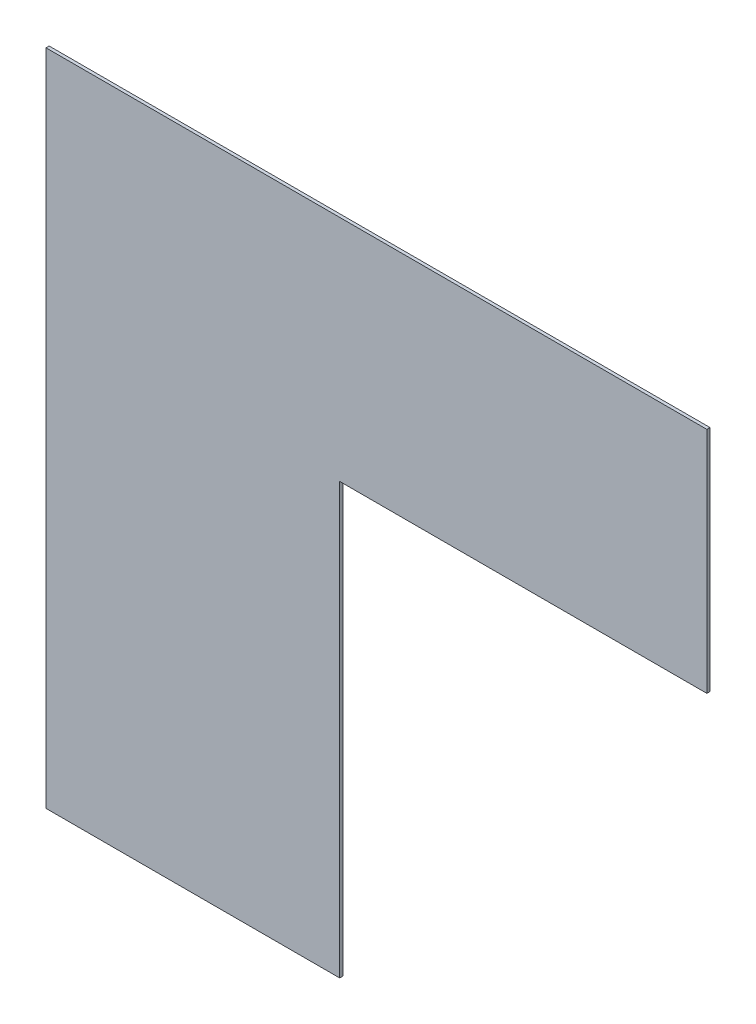
ISO-10303-21;
HEADER;
FILE_DESCRIPTION(('STEP AP214'),'2;1');
FILE_NAME('part.step','',(''),(''),'','','');
FILE_SCHEMA(('AUTOMOTIVE_DESIGN { 1 0 10303 214 1 1 1 1 }'));
ENDSEC;
DATA;
#1=APPLICATION_CONTEXT('core data for automotive mechanical design processes');
#2=APPLICATION_PROTOCOL_DEFINITION('international standard','automotive_design',2000,#1);
#3=PRODUCT_CONTEXT('',#1,'mechanical');
#4=PRODUCT('Part','Part','',(#3));
#5=PRODUCT_RELATED_PRODUCT_CATEGORY('part','',(#4));
#6=PRODUCT_DEFINITION_FORMATION('','',#4);
#7=PRODUCT_DEFINITION_CONTEXT('part definition',#1,'design');
#8=PRODUCT_DEFINITION('design','',#6,#7);
#9=PRODUCT_DEFINITION_SHAPE('','',#8);
#10=(LENGTH_UNIT() NAMED_UNIT(*) SI_UNIT(.MILLI.,.METRE.));
#11=(NAMED_UNIT(*) PLANE_ANGLE_UNIT() SI_UNIT($,.RADIAN.));
#12=(NAMED_UNIT(*) SI_UNIT($,.STERADIAN.) SOLID_ANGLE_UNIT());
#13=UNCERTAINTY_MEASURE_WITH_UNIT(LENGTH_MEASURE(1.E-05),#10,'distance_accuracy_value','');
#14=(GEOMETRIC_REPRESENTATION_CONTEXT(3) GLOBAL_UNCERTAINTY_ASSIGNED_CONTEXT((#13)) GLOBAL_UNIT_ASSIGNED_CONTEXT((#10,
#11,#12)) REPRESENTATION_CONTEXT('',''));
#15=CARTESIAN_POINT('',(0.,0.,0.));
#16=DIRECTION('',(0.,0.,1.));
#17=DIRECTION('',(1.,0.,0.));
#18=AXIS2_PLACEMENT_3D('',#15,#16,#17);
#19=CARTESIAN_POINT('',(350.,628.,3.));
#20=DIRECTION('',(-1.,0.,0.));
#21=DIRECTION('',(0.,0.,1.));
#22=AXIS2_PLACEMENT_3D('',#19,#20,#21);
#23=PLANE('',#22);
#24=DIRECTION('',(0.,1.,0.));
#25=VECTOR('',#24,1.);
#26=CARTESIAN_POINT('',(350.,628.,0.));
#27=LINE('',#26,#25);
#28=CARTESIAN_POINT('',(350.,410.,0.));
#29=VERTEX_POINT('',#28);
#30=CARTESIAN_POINT('',(350.,628.,0.));
#31=VERTEX_POINT('',#30);
#32=EDGE_CURVE('E116',#29,#31,#27,.T.);
#33=ORIENTED_EDGE('',*,*,#32,.T.);
#34=DIRECTION('',(0.,0.,-1.));
#35=VECTOR('',#34,1.);
#36=CARTESIAN_POINT('',(350.,628.,3.));
#37=LINE('',#36,#35);
#38=CARTESIAN_POINT('',(350.,628.,3.));
#39=VERTEX_POINT('',#38);
#40=EDGE_CURVE('E11',#39,#31,#37,.T.);
#41=ORIENTED_EDGE('',*,*,#40,.F.);
#42=DIRECTION('',(0.,1.,0.));
#43=VECTOR('',#42,1.);
#44=CARTESIAN_POINT('',(350.,628.,3.));
#45=LINE('',#44,#43);
#46=CARTESIAN_POINT('',(350.,410.,3.));
#47=VERTEX_POINT('',#46);
#48=EDGE_CURVE('E126',#47,#39,#45,.T.);
#49=ORIENTED_EDGE('',*,*,#48,.F.);
#50=DIRECTION('',(0.,0.,-1.));
#51=VECTOR('',#50,1.);
#52=CARTESIAN_POINT('',(350.,410.,3.));
#53=LINE('',#52,#51);
#54=EDGE_CURVE('E112',#47,#29,#53,.T.);
#55=ORIENTED_EDGE('',*,*,#54,.T.);
#56=EDGE_LOOP('',(#33,#41,#49,#55));
#57=FACE_BOUND('',#56,.T.);
#58=ADVANCED_FACE('F32',(#57),#23,.F.);
#59=CARTESIAN_POINT('',(350.,628.,3.));
#60=DIRECTION('',(0.,-1.,0.));
#61=DIRECTION('',(0.,0.,-1.));
#62=AXIS2_PLACEMENT_3D('',#59,#60,#61);
#63=PLANE('',#62);
#64=DIRECTION('',(-1.,0.,0.));
#65=VECTOR('',#64,1.);
#66=CARTESIAN_POINT('',(350.,628.,0.));
#67=LINE('',#66,#65);
#68=CARTESIAN_POINT('',(-280.,628.,0.));
#69=VERTEX_POINT('',#68);
#70=EDGE_CURVE('E119',#31,#69,#67,.T.);
#71=ORIENTED_EDGE('',*,*,#70,.T.);
#72=DIRECTION('',(0.,0.,-1.));
#73=VECTOR('',#72,1.);
#74=CARTESIAN_POINT('',(-280.,628.,3.));
#75=LINE('',#74,#73);
#76=CARTESIAN_POINT('',(-280.,628.,3.));
#77=VERTEX_POINT('',#76);
#78=EDGE_CURVE('E40',#77,#69,#75,.T.);
#79=ORIENTED_EDGE('',*,*,#78,.F.);
#80=DIRECTION('',(-1.,0.,0.));
#81=VECTOR('',#80,1.);
#82=CARTESIAN_POINT('',(350.,628.,3.));
#83=LINE('',#82,#81);
#84=EDGE_CURVE('E85',#39,#77,#83,.T.);
#85=ORIENTED_EDGE('',*,*,#84,.F.);
#86=ORIENTED_EDGE('',*,*,#40,.T.);
#87=EDGE_LOOP('',(#71,#79,#85,#86));
#88=FACE_BOUND('',#87,.T.);
#89=ADVANCED_FACE('F150',(#88),#63,.F.);
#90=CARTESIAN_POINT('',(-280.,628.,3.));
#91=DIRECTION('',(1.,0.,0.));
#92=DIRECTION('',(0.,0.,-1.));
#93=AXIS2_PLACEMENT_3D('',#90,#91,#92);
#94=PLANE('',#93);
#95=DIRECTION('',(0.,-1.,0.));
#96=VECTOR('',#95,1.);
#97=CARTESIAN_POINT('',(-280.,628.,0.));
#98=LINE('',#97,#96);
#99=CARTESIAN_POINT('',(-280.,0.,0.));
#100=VERTEX_POINT('',#99);
#101=EDGE_CURVE('E121',#69,#100,#98,.T.);
#102=ORIENTED_EDGE('',*,*,#101,.T.);
#103=DIRECTION('',(0.,0.,-1.));
#104=VECTOR('',#103,1.);
#105=CARTESIAN_POINT('',(-280.,0.,3.));
#106=LINE('',#105,#104);
#107=CARTESIAN_POINT('',(-280.,0.,3.));
#108=VERTEX_POINT('',#107);
#109=EDGE_CURVE('E107',#108,#100,#106,.T.);
#110=ORIENTED_EDGE('',*,*,#109,.F.);
#111=DIRECTION('',(0.,-1.,0.));
#112=VECTOR('',#111,1.);
#113=CARTESIAN_POINT('',(-280.,628.,3.));
#114=LINE('',#113,#112);
#115=EDGE_CURVE('E98',#77,#108,#114,.T.);
#116=ORIENTED_EDGE('',*,*,#115,.F.);
#117=ORIENTED_EDGE('',*,*,#78,.T.);
#118=EDGE_LOOP('',(#102,#110,#116,#117));
#119=FACE_BOUND('',#118,.T.);
#120=ADVANCED_FACE('F132',(#119),#94,.F.);
#121=CARTESIAN_POINT('',(0.,0.,3.));
#122=DIRECTION('',(0.,1.,0.));
#123=DIRECTION('',(-1.,0.,0.));
#124=AXIS2_PLACEMENT_3D('',#121,#122,#123);
#125=PLANE('',#124);
#126=DIRECTION('',(1.,0.,0.));
#127=VECTOR('',#126,1.);
#128=CARTESIAN_POINT('',(0.,0.,0.));
#129=LINE('',#128,#127);
#130=CARTESIAN_POINT('',(0.,0.,0.));
#131=VERTEX_POINT('',#130);
#132=EDGE_CURVE('E106',#100,#131,#129,.T.);
#133=ORIENTED_EDGE('',*,*,#132,.T.);
#134=DIRECTION('',(0.,0.,-1.));
#135=VECTOR('',#134,1.);
#136=CARTESIAN_POINT('',(0.,0.,3.));
#137=LINE('',#136,#135);
#138=CARTESIAN_POINT('',(0.,0.,3.));
#139=VERTEX_POINT('',#138);
#140=EDGE_CURVE('E103',#139,#131,#137,.T.);
#141=ORIENTED_EDGE('',*,*,#140,.F.);
#142=DIRECTION('',(1.,0.,0.));
#143=VECTOR('',#142,1.);
#144=CARTESIAN_POINT('',(0.,0.,3.));
#145=LINE('',#144,#143);
#146=EDGE_CURVE('E92',#108,#139,#145,.T.);
#147=ORIENTED_EDGE('',*,*,#146,.F.);
#148=ORIENTED_EDGE('',*,*,#109,.T.);
#149=EDGE_LOOP('',(#133,#141,#147,#148));
#150=FACE_BOUND('',#149,.T.);
#151=ADVANCED_FACE('F104',(#150),#125,.F.);
#152=CARTESIAN_POINT('',(0.,0.,3.));
#153=DIRECTION('',(-1.,0.,0.));
#154=DIRECTION('',(0.,0.,1.));
#155=AXIS2_PLACEMENT_3D('',#152,#153,#154);
#156=PLANE('',#155);
#157=DIRECTION('',(0.,1.,0.));
#158=VECTOR('',#157,1.);
#159=CARTESIAN_POINT('',(0.,0.,0.));
#160=LINE('',#159,#158);
#161=CARTESIAN_POINT('',(0.,410.,0.));
#162=VERTEX_POINT('',#161);
#163=EDGE_CURVE('E71',#131,#162,#160,.T.);
#164=ORIENTED_EDGE('',*,*,#163,.T.);
#165=DIRECTION('',(0.,0.,-1.));
#166=VECTOR('',#165,1.);
#167=CARTESIAN_POINT('',(0.,410.,3.));
#168=LINE('',#167,#166);
#169=CARTESIAN_POINT('',(0.,410.,3.));
#170=VERTEX_POINT('',#169);
#171=EDGE_CURVE('E108',#170,#162,#168,.T.);
#172=ORIENTED_EDGE('',*,*,#171,.F.);
#173=DIRECTION('',(0.,1.,0.));
#174=VECTOR('',#173,1.);
#175=CARTESIAN_POINT('',(0.,0.,3.));
#176=LINE('',#175,#174);
#177=EDGE_CURVE('E96',#139,#170,#176,.T.);
#178=ORIENTED_EDGE('',*,*,#177,.F.);
#179=ORIENTED_EDGE('',*,*,#140,.T.);
#180=EDGE_LOOP('',(#164,#172,#178,#179));
#181=FACE_BOUND('',#180,.T.);
#182=ADVANCED_FACE('F110',(#181),#156,.F.);
#183=CARTESIAN_POINT('',(0.,410.,3.));
#184=DIRECTION('',(0.,1.,0.));
#185=DIRECTION('',(-1.,0.,0.));
#186=AXIS2_PLACEMENT_3D('',#183,#184,#185);
#187=PLANE('',#186);
#188=DIRECTION('',(1.,0.,0.));
#189=VECTOR('',#188,1.);
#190=CARTESIAN_POINT('',(0.,410.,0.));
#191=LINE('',#190,#189);
#192=EDGE_CURVE('E77',#162,#29,#191,.T.);
#193=ORIENTED_EDGE('',*,*,#192,.T.);
#194=ORIENTED_EDGE('',*,*,#54,.F.);
#195=DIRECTION('',(1.,0.,0.));
#196=VECTOR('',#195,1.);
#197=CARTESIAN_POINT('',(0.,410.,3.));
#198=LINE('',#197,#196);
#199=EDGE_CURVE('E48',#170,#47,#198,.T.);
#200=ORIENTED_EDGE('',*,*,#199,.F.);
#201=ORIENTED_EDGE('',*,*,#171,.T.);
#202=EDGE_LOOP('',(#193,#194,#200,#201));
#203=FACE_BOUND('',#202,.T.);
#204=ADVANCED_FACE('F139',(#203),#187,.F.);
#205=CARTESIAN_POINT('',(0.,0.,3.));
#206=DIRECTION('',(0.,0.,1.));
#207=DIRECTION('',(1.,0.,0.));
#208=AXIS2_PLACEMENT_3D('',#205,#206,#207);
#209=PLANE('',#208);
#210=ORIENTED_EDGE('',*,*,#48,.T.);
#211=ORIENTED_EDGE('',*,*,#84,.T.);
#212=ORIENTED_EDGE('',*,*,#115,.T.);
#213=ORIENTED_EDGE('',*,*,#146,.T.);
#214=ORIENTED_EDGE('',*,*,#177,.T.);
#215=ORIENTED_EDGE('',*,*,#199,.T.);
#216=EDGE_LOOP('',(#210,#211,#212,#213,#214,#215));
#217=FACE_BOUND('',#216,.T.);
#218=ADVANCED_FACE('F94',(#217),#209,.T.);
#219=CARTESIAN_POINT('',(0.,0.,0.));
#220=DIRECTION('',(0.,0.,1.));
#221=DIRECTION('',(1.,0.,0.));
#222=AXIS2_PLACEMENT_3D('',#219,#220,#221);
#223=PLANE('',#222);
#224=ORIENTED_EDGE('',*,*,#32,.F.);
#225=ORIENTED_EDGE('',*,*,#192,.F.);
#226=ORIENTED_EDGE('',*,*,#163,.F.);
#227=ORIENTED_EDGE('',*,*,#132,.F.);
#228=ORIENTED_EDGE('',*,*,#101,.F.);
#229=ORIENTED_EDGE('',*,*,#70,.F.);
#230=EDGE_LOOP('',(#224,#225,#226,#227,#228,#229));
#231=FACE_BOUND('',#230,.T.);
#232=ADVANCED_FACE('F135',(#231),#223,.F.);
#233=CLOSED_SHELL('',(#58,#89,#120,#151,#182,#204,#218,#232));
#234=MANIFOLD_SOLID_BREP('B2',#233);
#235=ADVANCED_BREP_SHAPE_REPRESENTATION('',(#18,#234),#14);
#236=SHAPE_DEFINITION_REPRESENTATION(#9,#235);
ENDSEC;
END-ISO-10303-21;
